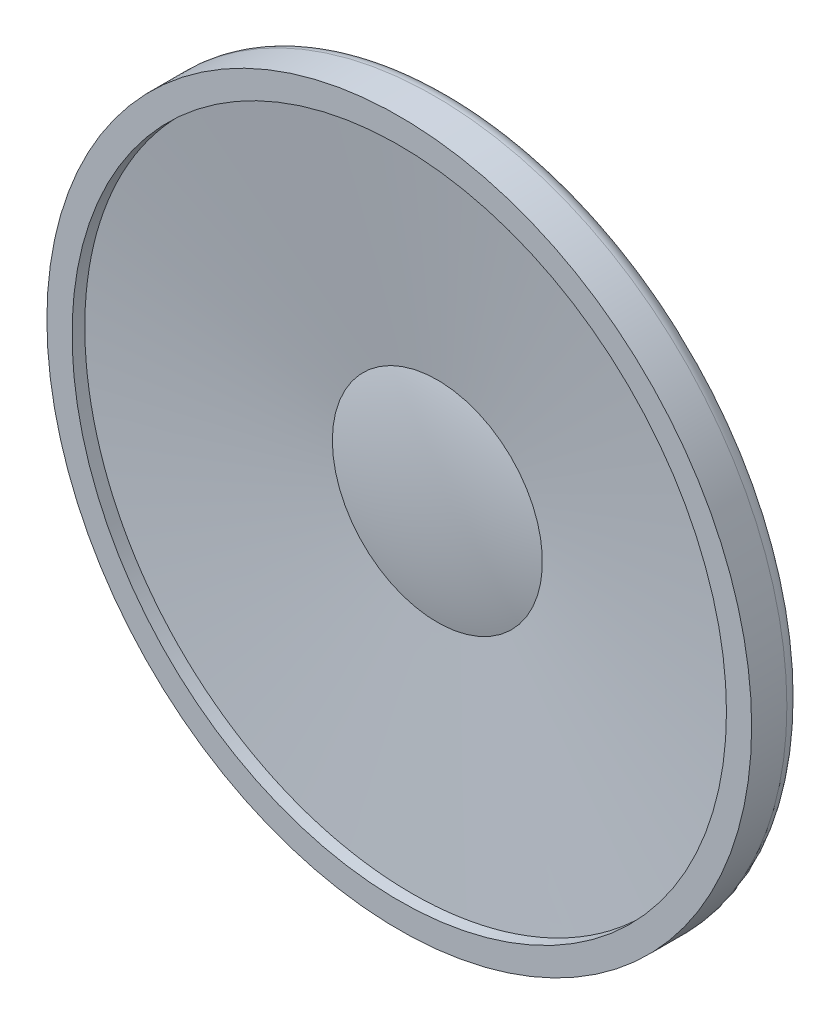
ISO-10303-21;
HEADER;
FILE_DESCRIPTION(('STEP AP214'),'2;1');
FILE_NAME('part.step','',(''),(''),'','','');
FILE_SCHEMA(('AUTOMOTIVE_DESIGN { 1 0 10303 214 1 1 1 1 }'));
ENDSEC;
DATA;
#1=APPLICATION_CONTEXT('core data for automotive mechanical design processes');
#2=APPLICATION_PROTOCOL_DEFINITION('international standard','automotive_design',2000,#1);
#3=PRODUCT_CONTEXT('',#1,'mechanical');
#4=PRODUCT('Part','Part','',(#3));
#5=PRODUCT_RELATED_PRODUCT_CATEGORY('part','',(#4));
#6=PRODUCT_DEFINITION_FORMATION('','',#4);
#7=PRODUCT_DEFINITION_CONTEXT('part definition',#1,'design');
#8=PRODUCT_DEFINITION('design','',#6,#7);
#9=PRODUCT_DEFINITION_SHAPE('','',#8);
#10=(LENGTH_UNIT() NAMED_UNIT(*) SI_UNIT(.MILLI.,.METRE.));
#11=(NAMED_UNIT(*) PLANE_ANGLE_UNIT() SI_UNIT($,.RADIAN.));
#12=(NAMED_UNIT(*) SI_UNIT($,.STERADIAN.) SOLID_ANGLE_UNIT());
#13=UNCERTAINTY_MEASURE_WITH_UNIT(LENGTH_MEASURE(1.E-05),#10,'distance_accuracy_value','');
#14=(GEOMETRIC_REPRESENTATION_CONTEXT(3) GLOBAL_UNCERTAINTY_ASSIGNED_CONTEXT((#13)) GLOBAL_UNIT_ASSIGNED_CONTEXT((#10,
#11,#12)) REPRESENTATION_CONTEXT('',''));
#15=CARTESIAN_POINT('',(0.,0.,0.));
#16=DIRECTION('',(0.,0.,1.));
#17=DIRECTION('',(1.,0.,0.));
#18=AXIS2_PLACEMENT_3D('',#15,#16,#17);
#19=CARTESIAN_POINT('',(0.,0.,-2.));
#20=CARTESIAN_POINT('',(-6.57581322514623,0.,-1.90704795126734));
#21=CARTESIAN_POINT('',(-13.,0.,-0.5));
#22=(BOUNDED_CURVE() B_SPLINE_CURVE(2,(#19,#20,#21),.UNSPECIFIED.,.F.,
.F.) B_SPLINE_CURVE_WITH_KNOTS((3,3),(0.,1.),
.UNSPECIFIED.) CURVE() GEOMETRIC_REPRESENTATION_ITEM() RATIONAL_B_SPLINE_CURVE((1.,
0.658700930773034,1.)) REPRESENTATION_ITEM(''));
#23=CARTESIAN_POINT('',(0.,0.,-2.));
#24=DIRECTION('',(0.,0.,-1.));
#25=AXIS1_PLACEMENT('',#23,#24);
#26=SURFACE_OF_REVOLUTION('',#22,#25);
#27=CARTESIAN_POINT('',(0.,0.,-0.5));
#28=DIRECTION('',(0.,0.,-1.));
#29=DIRECTION('',(-1.,0.,0.));
#30=AXIS2_PLACEMENT_3D('',#27,#28,#29);
#31=CIRCLE('',#30,13.);
#32=CARTESIAN_POINT('',(-13.,0.,-0.5));
#33=VERTEX_POINT('',#32);
#34=EDGE_CURVE('E51',#33,#33,#31,.T.);
#35=ORIENTED_EDGE('',*,*,#34,.T.);
#36=EDGE_LOOP('',(#35));
#37=FACE_BOUND('',#36,.T.);
#38=CARTESIAN_POINT('',(0.,0.,-2.));
#39=VERTEX_POINT('',#38);
#40=VERTEX_LOOP('',#39);
#41=FACE_BOUND('',#40,.T.);
#42=ADVANCED_FACE('F43',(#37,#41),#26,.F.);
#43=CARTESIAN_POINT('',(-4.17258172321156,0.,-1.51391132806224));
#44=CARTESIAN_POINT('',(-2.32060044079949,0.,-1.06389143003336));
#45=CARTESIAN_POINT('',(0.,0.,-1.06389143003336));
#46=(BOUNDED_CURVE() B_SPLINE_CURVE(2,(#43,#44,#45),.UNSPECIFIED.,.F.,
.F.) B_SPLINE_CURVE_WITH_KNOTS((3,3),(0.,1.),
.UNSPECIFIED.) CURVE() GEOMETRIC_REPRESENTATION_ITEM() RATIONAL_B_SPLINE_CURVE((1.,
0.948172254224293,1.)) REPRESENTATION_ITEM(''));
#47=CARTESIAN_POINT('',(0.,0.,-2.));
#48=DIRECTION('',(0.,0.,-1.));
#49=AXIS1_PLACEMENT('',#47,#48);
#50=SURFACE_OF_REVOLUTION('',#46,#49);
#51=CARTESIAN_POINT('',(0.,0.,-1.06389143003336));
#52=VERTEX_POINT('',#51);
#53=VERTEX_LOOP('',#52);
#54=FACE_BOUND('',#53,.T.);
#55=CARTESIAN_POINT('',(0.,0.,-1.51391132806224));
#56=DIRECTION('',(0.,0.,-1.));
#57=DIRECTION('',(-1.,0.,0.));
#58=AXIS2_PLACEMENT_3D('',#55,#56,#57);
#59=CIRCLE('',#58,4.17258172321156);
#60=CARTESIAN_POINT('',(-4.17258172321156,0.,-1.51391132806224));
#61=VERTEX_POINT('',#60);
#62=EDGE_CURVE('E12',#61,#61,#59,.T.);
#63=ORIENTED_EDGE('',*,*,#62,.F.);
#64=EDGE_LOOP('',(#63));
#65=FACE_BOUND('',#64,.T.);
#66=ADVANCED_FACE('F57',(#54,#65),#50,.F.);
#67=CARTESIAN_POINT('',(-13.,0.,-0.5));
#68=CARTESIAN_POINT('',(-6.34788376906216,0.,-1.26755187280304));
#69=CARTESIAN_POINT('',(-4.17258172321156,0.,-1.51391132806224));
#70=(BOUNDED_CURVE() B_SPLINE_CURVE(2,(#67,#68,#69),.UNSPECIFIED.,.F.,
.F.) B_SPLINE_CURVE_WITH_KNOTS((3,3),(0.,1.),
.UNSPECIFIED.) CURVE() GEOMETRIC_REPRESENTATION_ITEM() RATIONAL_B_SPLINE_CURVE((1.,
1.16302303171904,1.)) REPRESENTATION_ITEM(''));
#71=CARTESIAN_POINT('',(0.,0.,-2.));
#72=DIRECTION('',(0.,0.,-1.));
#73=AXIS1_PLACEMENT('',#71,#72);
#74=SURFACE_OF_REVOLUTION('',#70,#73);
#75=ORIENTED_EDGE('',*,*,#62,.T.);
#76=EDGE_LOOP('',(#75));
#77=FACE_BOUND('',#76,.T.);
#78=ORIENTED_EDGE('',*,*,#34,.F.);
#79=EDGE_LOOP('',(#78));
#80=FACE_BOUND('',#79,.T.);
#81=ADVANCED_FACE('F60',(#77,#80),#74,.F.);
#82=CLOSED_SHELL('',(#42,#66,#81));
#83=MANIFOLD_SOLID_BREP('B2',#82);
#84=CARTESIAN_POINT('',(0.,0.,-2.));
#85=DIRECTION('',(0.,0.,1.));
#86=DIRECTION('',(1.,0.,0.));
#87=AXIS2_PLACEMENT_3D('',#84,#85,#86);
#88=CYLINDRICAL_SURFACE('',#87,14.);
#89=CARTESIAN_POINT('',(0.,0.,-1.4));
#90=DIRECTION('',(0.,0.,1.));
#91=DIRECTION('',(1.,0.,0.));
#92=AXIS2_PLACEMENT_3D('',#89,#90,#91);
#93=CIRCLE('',#92,14.);
#94=CARTESIAN_POINT('',(14.,0.,-1.4));
#95=VERTEX_POINT('',#94);
#96=EDGE_CURVE('E213',#95,#95,#93,.T.);
#97=ORIENTED_EDGE('',*,*,#96,.T.);
#98=EDGE_LOOP('',(#97));
#99=FACE_BOUND('',#98,.T.);
#100=CARTESIAN_POINT('',(0.,0.,0.));
#101=DIRECTION('',(0.,0.,1.));
#102=DIRECTION('',(1.,0.,0.));
#103=AXIS2_PLACEMENT_3D('',#100,#101,#102);
#104=CIRCLE('',#103,14.);
#105=CARTESIAN_POINT('',(14.,0.,0.));
#106=VERTEX_POINT('',#105);
#107=EDGE_CURVE('E205',#106,#106,#104,.T.);
#108=ORIENTED_EDGE('',*,*,#107,.F.);
#109=EDGE_LOOP('',(#108));
#110=FACE_BOUND('',#109,.T.);
#111=ADVANCED_FACE('F111',(#99,#110),#88,.T.);
#112=CARTESIAN_POINT('',(0.,0.,-2.));
#113=DIRECTION('',(0.,0.,1.));
#114=DIRECTION('',(1.,0.,0.));
#115=AXIS2_PLACEMENT_3D('',#112,#113,#114);
#116=PLANE('',#115);
#117=CARTESIAN_POINT('',(0.,0.,-2.));
#118=DIRECTION('',(0.,0.,1.));
#119=DIRECTION('',(1.,0.,0.));
#120=AXIS2_PLACEMENT_3D('',#117,#118,#119);
#121=CIRCLE('',#120,13.4);
#122=CARTESIAN_POINT('',(13.4,0.,-2.));
#123=VERTEX_POINT('',#122);
#124=EDGE_CURVE('E216',#123,#123,#121,.F.);
#125=ORIENTED_EDGE('',*,*,#124,.T.);
#126=EDGE_LOOP('',(#125));
#127=FACE_BOUND('',#126,.T.);
#128=CARTESIAN_POINT('',(0.,0.,-2.));
#129=DIRECTION('',(0.,0.,1.));
#130=DIRECTION('',(1.,0.,0.));
#131=AXIS2_PLACEMENT_3D('',#128,#129,#130);
#132=CIRCLE('',#131,12.5);
#133=CARTESIAN_POINT('',(12.5,0.,-2.));
#134=VERTEX_POINT('',#133);
#135=EDGE_CURVE('E210',#134,#134,#132,.F.);
#136=ORIENTED_EDGE('',*,*,#135,.F.);
#137=EDGE_LOOP('',(#136));
#138=FACE_BOUND('',#137,.T.);
#139=ADVANCED_FACE('F250',(#127,#138),#116,.F.);
#140=CARTESIAN_POINT('',(0.,0.,0.));
#141=DIRECTION('',(0.,0.,1.));
#142=DIRECTION('',(1.,0.,0.));
#143=AXIS2_PLACEMENT_3D('',#140,#141,#142);
#144=PLANE('',#143);
#145=CARTESIAN_POINT('',(0.,0.,0.));
#146=DIRECTION('',(0.,0.,1.));
#147=DIRECTION('',(1.,0.,0.));
#148=AXIS2_PLACEMENT_3D('',#145,#146,#147);
#149=CIRCLE('',#148,13.);
#150=CARTESIAN_POINT('',(13.,0.,0.));
#151=VERTEX_POINT('',#150);
#152=EDGE_CURVE('E195',#151,#151,#149,.T.);
#153=ORIENTED_EDGE('',*,*,#152,.F.);
#154=EDGE_LOOP('',(#153));
#155=FACE_BOUND('',#154,.T.);
#156=ORIENTED_EDGE('',*,*,#107,.T.);
#157=EDGE_LOOP('',(#156));
#158=FACE_BOUND('',#157,.T.);
#159=ADVANCED_FACE('F244',(#155,#158),#144,.T.);
#160=CARTESIAN_POINT('',(0.,0.,-3.));
#161=DIRECTION('',(0.,0.,1.));
#162=DIRECTION('',(1.,0.,0.));
#163=AXIS2_PLACEMENT_3D('',#160,#161,#162);
#164=CYLINDRICAL_SURFACE('',#163,12.5);
#165=CARTESIAN_POINT('',(0.,0.,-2.4));
#166=DIRECTION('',(0.,0.,-1.));
#167=DIRECTION('',(-1.,0.,0.));
#168=AXIS2_PLACEMENT_3D('',#165,#166,#167);
#169=CIRCLE('',#168,12.5);
#170=CARTESIAN_POINT('',(-12.5,0.,-2.4));
#171=VERTEX_POINT('',#170);
#172=EDGE_CURVE('E124',#171,#171,#169,.F.);
#173=ORIENTED_EDGE('',*,*,#172,.T.);
#174=EDGE_LOOP('',(#173));
#175=FACE_BOUND('',#174,.T.);
#176=ORIENTED_EDGE('',*,*,#135,.T.);
#177=EDGE_LOOP('',(#176));
#178=FACE_BOUND('',#177,.T.);
#179=ADVANCED_FACE('F224',(#175,#178),#164,.T.);
#180=CARTESIAN_POINT('',(0.,0.,-3.));
#181=DIRECTION('',(0.,0.,-1.));
#182=DIRECTION('',(-1.,0.,0.));
#183=AXIS2_PLACEMENT_3D('',#180,#181,#182);
#184=PLANE('',#183);
#185=CARTESIAN_POINT('',(6.24010589927625,6.84507009575634,-3.));
#186=DIRECTION('',(0.,0.,-1.));
#187=DIRECTION('',(-0.739008917220658,0.673695643646558,0.));
#188=AXIS2_PLACEMENT_3D('',#185,#186,#187);
#189=CIRCLE('',#188,1.);
#190=CARTESIAN_POINT('',(5.50109698205559,7.5187657394029,-3.));
#191=VERTEX_POINT('',#190);
#192=EDGE_CURVE('E141',#191,#191,#189,.T.);
#193=ORIENTED_EDGE('',*,*,#192,.F.);
#194=EDGE_LOOP('',(#193));
#195=FACE_BOUND('',#194,.T.);
#196=CARTESIAN_POINT('',(8.29144998617627,4.12865152038016,-3.));
#197=DIRECTION('',(0.,0.,-1.));
#198=DIRECTION('',(-0.445738355776536,0.895163291355063,0.));
#199=AXIS2_PLACEMENT_3D('',#196,#197,#198);
#200=CIRCLE('',#199,1.);
#201=CARTESIAN_POINT('',(7.84571163039974,5.02381481173523,-3.));
#202=VERTEX_POINT('',#201);
#203=EDGE_CURVE('E365',#202,#202,#200,.T.);
#204=ORIENTED_EDGE('',*,*,#203,.F.);
#205=EDGE_LOOP('',(#204));
#206=FACE_BOUND('',#205,.T.);
#207=CARTESIAN_POINT('',(9.22298780793276,0.854635679528805,-3.));
#208=DIRECTION('',(0.,0.,-1.));
#209=DIRECTION('',(-0.0922683594632987,0.995734176295035,0.));
#210=AXIS2_PLACEMENT_3D('',#207,#208,#209);
#211=CIRCLE('',#210,1.);
#212=CARTESIAN_POINT('',(9.13071944846946,1.85036985582384,-3.));
#213=VERTEX_POINT('',#212);
#214=EDGE_CURVE('E368',#213,#213,#211,.T.);
#215=ORIENTED_EDGE('',*,*,#214,.F.);
#216=EDGE_LOOP('',(#215));
#217=FACE_BOUND('',#216,.T.);
#218=CARTESIAN_POINT('',(8.90891001988823,-2.5348034455427,-3.));
#219=DIRECTION('',(0.,0.,-1.));
#220=DIRECTION('',(0.273662990072087,0.961825643172818,0.));
#221=AXIS2_PLACEMENT_3D('',#218,#219,#220);
#222=CIRCLE('',#221,1.);
#223=CARTESIAN_POINT('',(9.18257300996031,-1.57297780236988,-3.));
#224=VERTEX_POINT('',#223);
#225=EDGE_CURVE('E373',#224,#224,#222,.T.);
#226=ORIENTED_EDGE('',*,*,#225,.F.);
#227=EDGE_LOOP('',(#226));
#228=FACE_BOUND('',#227,.T.);
#229=CARTESIAN_POINT('',(7.39163456768319,-5.5819033194629,-3.));
#230=DIRECTION('',(0.,0.,-1.));
#231=DIRECTION('',(0.602634636379261,0.798017227280236,0.));
#232=AXIS2_PLACEMENT_3D('',#229,#230,#231);
#233=CIRCLE('',#232,1.);
#234=CARTESIAN_POINT('',(7.99426920406245,-4.78388609218266,-3.));
#235=VERTEX_POINT('',#234);
#236=EDGE_CURVE('E376',#235,#235,#233,.T.);
#237=ORIENTED_EDGE('',*,*,#236,.F.);
#238=EDGE_LOOP('',(#237));
#239=FACE_BOUND('',#238,.T.);
#240=CARTESIAN_POINT('',(4.87607790865146,-7.87513621969558,-3.));
#241=DIRECTION('',(0.,0.,-1.));
#242=DIRECTION('',(0.850217135729617,0.526432162877351,0.));
#243=AXIS2_PLACEMENT_3D('',#240,#241,#242);
#244=CIRCLE('',#243,1.);
#245=CARTESIAN_POINT('',(5.72629504438108,-7.34870405681823,-3.));
#246=VERTEX_POINT('',#245);
#247=EDGE_CURVE('E379',#246,#246,#244,.T.);
#248=ORIENTED_EDGE('',*,*,#247,.F.);
#249=EDGE_LOOP('',(#248));
#250=FACE_BOUND('',#249,.T.);
#251=CARTESIAN_POINT('',(1.70197990877592,-9.10478833582215,-3.));
#252=DIRECTION('',(0.,0.,-1.));
#253=DIRECTION('',(0.982973099683903,0.183749517816564,0.));
#254=AXIS2_PLACEMENT_3D('',#251,#252,#253);
#255=CIRCLE('',#254,1.);
#256=CARTESIAN_POINT('',(2.68495300845983,-8.92103881800559,-3.));
#257=VERTEX_POINT('',#256);
#258=EDGE_CURVE('E382',#257,#257,#255,.T.);
#259=ORIENTED_EDGE('',*,*,#258,.F.);
#260=EDGE_LOOP('',(#259));
#261=FACE_BOUND('',#260,.T.);
#262=CARTESIAN_POINT('',(-1.70197990877605,-9.10478833582213,-3.));
#263=DIRECTION('',(0.,0.,-1.));
#264=DIRECTION('',(0.9829730996839,-0.183749517816578,0.));
#265=AXIS2_PLACEMENT_3D('',#262,#263,#264);
#266=CIRCLE('',#265,1.);
#267=CARTESIAN_POINT('',(-0.719006809092148,-9.28853785363871,-3.));
#268=VERTEX_POINT('',#267);
#269=EDGE_CURVE('E385',#268,#268,#266,.T.);
#270=ORIENTED_EDGE('',*,*,#269,.F.);
#271=EDGE_LOOP('',(#270));
#272=FACE_BOUND('',#271,.T.);
#273=CARTESIAN_POINT('',(-4.87607790865157,-7.87513621969551,-3.));
#274=DIRECTION('',(0.,0.,-1.));
#275=DIRECTION('',(0.85021713572961,-0.526432162877363,0.));
#276=AXIS2_PLACEMENT_3D('',#273,#274,#275);
#277=CIRCLE('',#276,1.);
#278=CARTESIAN_POINT('',(-4.02586077292196,-8.40156838257288,-3.));
#279=VERTEX_POINT('',#278);
#280=EDGE_CURVE('E388',#279,#279,#277,.T.);
#281=ORIENTED_EDGE('',*,*,#280,.F.);
#282=EDGE_LOOP('',(#281));
#283=FACE_BOUND('',#282,.T.);
#284=CARTESIAN_POINT('',(-7.39163456768327,-5.5819033194628,-3.));
#285=DIRECTION('',(0.,0.,-1.));
#286=DIRECTION('',(0.602634636379249,-0.798017227280245,0.));
#287=AXIS2_PLACEMENT_3D('',#284,#285,#286);
#288=CIRCLE('',#287,1.);
#289=CARTESIAN_POINT('',(-6.78899993130402,-6.37992054674304,-3.));
#290=VERTEX_POINT('',#289);
#291=EDGE_CURVE('E391',#290,#290,#288,.T.);
#292=ORIENTED_EDGE('',*,*,#291,.F.);
#293=EDGE_LOOP('',(#292));
#294=FACE_BOUND('',#293,.T.);
#295=CARTESIAN_POINT('',(-8.90891001988826,-2.53480344554258,-3.));
#296=DIRECTION('',(0.,0.,-1.));
#297=DIRECTION('',(0.273662990072073,-0.961825643172822,0.));
#298=AXIS2_PLACEMENT_3D('',#295,#296,#297);
#299=CIRCLE('',#298,1.);
#300=CARTESIAN_POINT('',(-8.63524702981619,-3.4966290887154,-3.));
#301=VERTEX_POINT('',#300);
#302=EDGE_CURVE('E394',#301,#301,#299,.T.);
#303=ORIENTED_EDGE('',*,*,#302,.F.);
#304=EDGE_LOOP('',(#303));
#305=FACE_BOUND('',#304,.T.);
#306=CARTESIAN_POINT('',(-9.22298780793275,0.854635679528937,-3.));
#307=DIRECTION('',(0.,0.,-1.));
#308=DIRECTION('',(-0.092268359463313,-0.995734176295033,0.));
#309=AXIS2_PLACEMENT_3D('',#306,#307,#308);
#310=CIRCLE('',#309,1.);
#311=CARTESIAN_POINT('',(-9.31525616739606,-0.141098496766097,-3.));
#312=VERTEX_POINT('',#311);
#313=EDGE_CURVE('E397',#312,#312,#310,.T.);
#314=ORIENTED_EDGE('',*,*,#313,.F.);
#315=EDGE_LOOP('',(#314));
#316=FACE_BOUND('',#315,.T.);
#317=CARTESIAN_POINT('',(-8.29144998617621,4.12865152038028,-3.));
#318=DIRECTION('',(0.,0.,-1.));
#319=DIRECTION('',(-0.445738355776549,-0.895163291355057,0.));
#320=AXIS2_PLACEMENT_3D('',#317,#318,#319);
#321=CIRCLE('',#320,1.);
#322=CARTESIAN_POINT('',(-8.73718834195276,3.23348822902523,-3.));
#323=VERTEX_POINT('',#322);
#324=EDGE_CURVE('E400',#323,#323,#321,.T.);
#325=ORIENTED_EDGE('',*,*,#324,.F.);
#326=EDGE_LOOP('',(#325));
#327=FACE_BOUND('',#326,.T.);
#328=CARTESIAN_POINT('',(-6.24010589927615,6.84507009575643,-3.));
#329=DIRECTION('',(0.,0.,-1.));
#330=DIRECTION('',(-0.739008917220668,-0.673695643646548,0.));
#331=AXIS2_PLACEMENT_3D('',#328,#329,#330);
#332=CIRCLE('',#331,1.);
#333=CARTESIAN_POINT('',(-6.97911481649682,6.17137445210988,-3.));
#334=VERTEX_POINT('',#333);
#335=EDGE_CURVE('E402',#334,#334,#332,.T.);
#336=ORIENTED_EDGE('',*,*,#335,.F.);
#337=EDGE_LOOP('',(#336));
#338=FACE_BOUND('',#337,.T.);
#339=CARTESIAN_POINT('',(-3.34600093305839,8.63702402485789,-3.));
#340=DIRECTION('',(0.,0.,-1.));
#341=DIRECTION('',(-0.932472229404361,-0.361241666187141,0.));
#342=AXIS2_PLACEMENT_3D('',#339,#340,#341);
#343=CIRCLE('',#342,1.);
#344=CARTESIAN_POINT('',(-4.27847316246275,8.27578235867075,-3.));
#345=VERTEX_POINT('',#344);
#346=EDGE_CURVE('E189',#345,#345,#343,.T.);
#347=ORIENTED_EDGE('',*,*,#346,.F.);
#348=EDGE_LOOP('',(#347));
#349=FACE_BOUND('',#348,.T.);
#350=CARTESIAN_POINT('',(3.34600093305851,8.63702402485784,-3.));
#351=DIRECTION('',(0.,0.,-1.));
#352=DIRECTION('',(-0.932472229404355,0.361241666187154,0.));
#353=AXIS2_PLACEMENT_3D('',#350,#351,#352);
#354=CIRCLE('',#353,1.);
#355=CARTESIAN_POINT('',(2.41352870365415,8.998265691045,-3.));
#356=VERTEX_POINT('',#355);
#357=EDGE_CURVE('E136',#356,#356,#354,.T.);
#358=ORIENTED_EDGE('',*,*,#357,.F.);
#359=EDGE_LOOP('',(#358));
#360=FACE_BOUND('',#359,.T.);
#361=CARTESIAN_POINT('',(0.,9.2625,-3.));
#362=DIRECTION('',(0.,0.,-1.));
#363=DIRECTION('',(-1.,0.,0.));
#364=AXIS2_PLACEMENT_3D('',#361,#362,#363);
#365=CIRCLE('',#364,1.);
#366=CARTESIAN_POINT('',(-1.,9.2625,-3.));
#367=VERTEX_POINT('',#366);
#368=EDGE_CURVE('E132',#367,#367,#365,.T.);
#369=ORIENTED_EDGE('',*,*,#368,.F.);
#370=EDGE_LOOP('',(#369));
#371=FACE_BOUND('',#370,.T.);
#372=CARTESIAN_POINT('',(0.,0.,-3.));
#373=DIRECTION('',(0.,0.,-1.));
#374=DIRECTION('',(-1.,0.,0.));
#375=AXIS2_PLACEMENT_3D('',#372,#373,#374);
#376=CIRCLE('',#375,6.625);
#377=CARTESIAN_POINT('',(-6.625,0.,-3.));
#378=VERTEX_POINT('',#377);
#379=EDGE_CURVE('E131',#378,#378,#376,.T.);
#380=ORIENTED_EDGE('',*,*,#379,.F.);
#381=EDGE_LOOP('',(#380));
#382=FACE_BOUND('',#381,.T.);
#383=CARTESIAN_POINT('',(0.,0.,-3.));
#384=DIRECTION('',(0.,0.,-1.));
#385=DIRECTION('',(-1.,0.,0.));
#386=AXIS2_PLACEMENT_3D('',#383,#384,#385);
#387=CIRCLE('',#386,11.9);
#388=CARTESIAN_POINT('',(-11.9,0.,-3.));
#389=VERTEX_POINT('',#388);
#390=EDGE_CURVE('E219',#389,#389,#387,.T.);
#391=ORIENTED_EDGE('',*,*,#390,.T.);
#392=EDGE_LOOP('',(#391));
#393=FACE_BOUND('',#392,.T.);
#394=ADVANCED_FACE('F234',(#195,#206,#217,#228,#239,#250,#261,#272,#283,#294,#305,#316,#327,
#338,#349,#360,#371,#382,#393),#184,.T.);
#395=CARTESIAN_POINT('',(0.,0.,-1.4));
#396=DIRECTION('',(0.,0.,1.));
#397=DIRECTION('',(1.,0.,0.));
#398=AXIS2_PLACEMENT_3D('',#395,#396,#397);
#399=TOROIDAL_SURFACE('',#398,13.4,0.6);
#400=ORIENTED_EDGE('',*,*,#124,.F.);
#401=EDGE_LOOP('',(#400));
#402=FACE_BOUND('',#401,.T.);
#403=ORIENTED_EDGE('',*,*,#96,.F.);
#404=EDGE_LOOP('',(#403));
#405=FACE_BOUND('',#404,.T.);
#406=ADVANCED_FACE('F231',(#402,#405),#399,.T.);
#407=CARTESIAN_POINT('',(0.,0.,-2.4));
#408=DIRECTION('',(0.,0.,-1.));
#409=DIRECTION('',(-1.,0.,0.));
#410=AXIS2_PLACEMENT_3D('',#407,#408,#409);
#411=TOROIDAL_SURFACE('',#410,11.9,0.6);
#412=ORIENTED_EDGE('',*,*,#172,.F.);
#413=EDGE_LOOP('',(#412));
#414=FACE_BOUND('',#413,.T.);
#415=ORIENTED_EDGE('',*,*,#390,.F.);
#416=EDGE_LOOP('',(#415));
#417=FACE_BOUND('',#416,.T.);
#418=ADVANCED_FACE('F227',(#414,#417),#411,.T.);
#419=CARTESIAN_POINT('',(0.,0.,-2.));
#420=DIRECTION('',(0.,0.,1.));
#421=DIRECTION('',(1.,0.,0.));
#422=AXIS2_PLACEMENT_3D('',#419,#420,#421);
#423=CYLINDRICAL_SURFACE('',#422,13.);
#424=ORIENTED_EDGE('',*,*,#152,.T.);
#425=EDGE_LOOP('',(#424));
#426=FACE_BOUND('',#425,.T.);
#427=CARTESIAN_POINT('',(0.,0.,-1.));
#428=DIRECTION('',(0.,0.,1.));
#429=DIRECTION('',(1.,0.,0.));
#430=AXIS2_PLACEMENT_3D('',#427,#428,#429);
#431=CIRCLE('',#430,13.);
#432=CARTESIAN_POINT('',(13.,0.,-1.));
#433=VERTEX_POINT('',#432);
#434=EDGE_CURVE('E196',#433,#433,#431,.T.);
#435=ORIENTED_EDGE('',*,*,#434,.F.);
#436=EDGE_LOOP('',(#435));
#437=FACE_BOUND('',#436,.T.);
#438=ADVANCED_FACE('F230',(#426,#437),#423,.F.);
#439=CARTESIAN_POINT('',(0.,0.,-1.));
#440=DIRECTION('',(0.,0.,1.));
#441=DIRECTION('',(1.,0.,0.));
#442=AXIS2_PLACEMENT_3D('',#439,#440,#441);
#443=PLANE('',#442);
#444=ORIENTED_EDGE('',*,*,#434,.T.);
#445=EDGE_LOOP('',(#444));
#446=FACE_BOUND('',#445,.T.);
#447=CARTESIAN_POINT('',(0.,0.,-1.));
#448=DIRECTION('',(0.,0.,1.));
#449=DIRECTION('',(1.,0.,0.));
#450=AXIS2_PLACEMENT_3D('',#447,#448,#449);
#451=CIRCLE('',#450,11.5);
#452=CARTESIAN_POINT('',(11.5,0.,-1.));
#453=VERTEX_POINT('',#452);
#454=EDGE_CURVE('E200',#453,#453,#451,.F.);
#455=ORIENTED_EDGE('',*,*,#454,.T.);
#456=EDGE_LOOP('',(#455));
#457=FACE_BOUND('',#456,.T.);
#458=ADVANCED_FACE('F270',(#446,#457),#443,.T.);
#459=CARTESIAN_POINT('',(0.,0.,-3.));
#460=DIRECTION('',(0.,0.,1.));
#461=DIRECTION('',(1.,0.,0.));
#462=AXIS2_PLACEMENT_3D('',#459,#460,#461);
#463=CYLINDRICAL_SURFACE('',#462,11.5);
#464=CARTESIAN_POINT('',(0.,0.,-2.5));
#465=DIRECTION('',(0.,0.,-1.));
#466=DIRECTION('',(-1.,0.,0.));
#467=AXIS2_PLACEMENT_3D('',#464,#465,#466);
#468=CIRCLE('',#467,11.5);
#469=CARTESIAN_POINT('',(-11.5,0.,-2.5));
#470=VERTEX_POINT('',#469);
#471=EDGE_CURVE('E199',#470,#470,#468,.T.);
#472=ORIENTED_EDGE('',*,*,#471,.T.);
#473=EDGE_LOOP('',(#472));
#474=FACE_BOUND('',#473,.T.);
#475=ORIENTED_EDGE('',*,*,#454,.F.);
#476=EDGE_LOOP('',(#475));
#477=FACE_BOUND('',#476,.T.);
#478=ADVANCED_FACE('F276',(#474,#477),#463,.F.);
#479=CARTESIAN_POINT('',(0.,0.,-2.5));
#480=DIRECTION('',(0.,0.,-1.));
#481=DIRECTION('',(-1.,0.,0.));
#482=AXIS2_PLACEMENT_3D('',#479,#480,#481);
#483=PLANE('',#482);
#484=CARTESIAN_POINT('',(6.24010589927625,6.84507009575634,-2.5));
#485=DIRECTION('',(0.,0.,-1.));
#486=DIRECTION('',(-1.,0.,0.));
#487=AXIS2_PLACEMENT_3D('',#484,#485,#486);
#488=CIRCLE('',#487,1.);
#489=CARTESIAN_POINT('',(5.24010589927625,6.84507009575634,-2.5));
#490=VERTEX_POINT('',#489);
#491=EDGE_CURVE('E115',#490,#490,#488,.T.);
#492=ORIENTED_EDGE('',*,*,#491,.T.);
#493=EDGE_LOOP('',(#492));
#494=FACE_BOUND('',#493,.T.);
#495=CARTESIAN_POINT('',(8.29144998617627,4.12865152038016,-2.5));
#496=DIRECTION('',(0.,0.,-1.));
#497=DIRECTION('',(-1.,0.,0.));
#498=AXIS2_PLACEMENT_3D('',#495,#496,#497);
#499=CIRCLE('',#498,1.);
#500=CARTESIAN_POINT('',(7.29144998617627,4.12865152038016,-2.5));
#501=VERTEX_POINT('',#500);
#502=EDGE_CURVE('E176',#501,#501,#499,.T.);
#503=ORIENTED_EDGE('',*,*,#502,.T.);
#504=EDGE_LOOP('',(#503));
#505=FACE_BOUND('',#504,.T.);
#506=CARTESIAN_POINT('',(9.22298780793276,0.854635679528805,-2.5));
#507=DIRECTION('',(0.,0.,-1.));
#508=DIRECTION('',(-1.,0.,0.));
#509=AXIS2_PLACEMENT_3D('',#506,#507,#508);
#510=CIRCLE('',#509,1.);
#511=CARTESIAN_POINT('',(8.22298780793276,0.854635679528805,-2.5));
#512=VERTEX_POINT('',#511);
#513=EDGE_CURVE('E174',#512,#512,#510,.T.);
#514=ORIENTED_EDGE('',*,*,#513,.T.);
#515=EDGE_LOOP('',(#514));
#516=FACE_BOUND('',#515,.T.);
#517=CARTESIAN_POINT('',(8.90891001988823,-2.5348034455427,-2.5));
#518=DIRECTION('',(0.,0.,-1.));
#519=DIRECTION('',(-1.,0.,0.));
#520=AXIS2_PLACEMENT_3D('',#517,#518,#519);
#521=CIRCLE('',#520,1.);
#522=CARTESIAN_POINT('',(7.90891001988823,-2.5348034455427,-2.5));
#523=VERTEX_POINT('',#522);
#524=EDGE_CURVE('E171',#523,#523,#521,.T.);
#525=ORIENTED_EDGE('',*,*,#524,.T.);
#526=EDGE_LOOP('',(#525));
#527=FACE_BOUND('',#526,.T.);
#528=CARTESIAN_POINT('',(7.39163456768319,-5.5819033194629,-2.5));
#529=DIRECTION('',(0.,0.,-1.));
#530=DIRECTION('',(-1.,0.,0.));
#531=AXIS2_PLACEMENT_3D('',#528,#529,#530);
#532=CIRCLE('',#531,1.);
#533=CARTESIAN_POINT('',(6.39163456768319,-5.5819033194629,-2.5));
#534=VERTEX_POINT('',#533);
#535=EDGE_CURVE('E168',#534,#534,#532,.T.);
#536=ORIENTED_EDGE('',*,*,#535,.T.);
#537=EDGE_LOOP('',(#536));
#538=FACE_BOUND('',#537,.T.);
#539=CARTESIAN_POINT('',(4.87607790865146,-7.87513621969558,-2.5));
#540=DIRECTION('',(0.,0.,-1.));
#541=DIRECTION('',(-1.,0.,0.));
#542=AXIS2_PLACEMENT_3D('',#539,#540,#541);
#543=CIRCLE('',#542,1.);
#544=CARTESIAN_POINT('',(3.87607790865146,-7.87513621969558,-2.5));
#545=VERTEX_POINT('',#544);
#546=EDGE_CURVE('E165',#545,#545,#543,.T.);
#547=ORIENTED_EDGE('',*,*,#546,.T.);
#548=EDGE_LOOP('',(#547));
#549=FACE_BOUND('',#548,.T.);
#550=CARTESIAN_POINT('',(1.70197990877592,-9.10478833582215,-2.5));
#551=DIRECTION('',(0.,0.,-1.));
#552=DIRECTION('',(-1.,0.,0.));
#553=AXIS2_PLACEMENT_3D('',#550,#551,#552);
#554=CIRCLE('',#553,1.);
#555=CARTESIAN_POINT('',(0.701979908775922,-9.10478833582215,-2.5));
#556=VERTEX_POINT('',#555);
#557=EDGE_CURVE('E162',#556,#556,#554,.T.);
#558=ORIENTED_EDGE('',*,*,#557,.T.);
#559=EDGE_LOOP('',(#558));
#560=FACE_BOUND('',#559,.T.);
#561=CARTESIAN_POINT('',(-1.70197990877605,-9.10478833582213,-2.5));
#562=DIRECTION('',(0.,0.,-1.));
#563=DIRECTION('',(-1.,0.,0.));
#564=AXIS2_PLACEMENT_3D('',#561,#562,#563);
#565=CIRCLE('',#564,1.);
#566=CARTESIAN_POINT('',(-2.70197990877605,-9.10478833582213,-2.5));
#567=VERTEX_POINT('',#566);
#568=EDGE_CURVE('E159',#567,#567,#565,.T.);
#569=ORIENTED_EDGE('',*,*,#568,.T.);
#570=EDGE_LOOP('',(#569));
#571=FACE_BOUND('',#570,.T.);
#572=CARTESIAN_POINT('',(-4.87607790865157,-7.87513621969551,-2.5));
#573=DIRECTION('',(0.,0.,-1.));
#574=DIRECTION('',(-1.,0.,0.));
#575=AXIS2_PLACEMENT_3D('',#572,#573,#574);
#576=CIRCLE('',#575,1.);
#577=CARTESIAN_POINT('',(-5.87607790865157,-7.87513621969551,-2.5));
#578=VERTEX_POINT('',#577);
#579=EDGE_CURVE('E156',#578,#578,#576,.T.);
#580=ORIENTED_EDGE('',*,*,#579,.T.);
#581=EDGE_LOOP('',(#580));
#582=FACE_BOUND('',#581,.T.);
#583=CARTESIAN_POINT('',(-7.39163456768327,-5.5819033194628,-2.5));
#584=DIRECTION('',(0.,0.,-1.));
#585=DIRECTION('',(-1.,0.,0.));
#586=AXIS2_PLACEMENT_3D('',#583,#584,#585);
#587=CIRCLE('',#586,1.);
#588=CARTESIAN_POINT('',(-8.39163456768327,-5.5819033194628,-2.5));
#589=VERTEX_POINT('',#588);
#590=EDGE_CURVE('E153',#589,#589,#587,.T.);
#591=ORIENTED_EDGE('',*,*,#590,.T.);
#592=EDGE_LOOP('',(#591));
#593=FACE_BOUND('',#592,.T.);
#594=CARTESIAN_POINT('',(-8.90891001988826,-2.53480344554258,-2.5));
#595=DIRECTION('',(0.,0.,-1.));
#596=DIRECTION('',(-1.,0.,0.));
#597=AXIS2_PLACEMENT_3D('',#594,#595,#596);
#598=CIRCLE('',#597,1.);
#599=CARTESIAN_POINT('',(-9.90891001988826,-2.53480344554258,-2.5));
#600=VERTEX_POINT('',#599);
#601=EDGE_CURVE('E150',#600,#600,#598,.T.);
#602=ORIENTED_EDGE('',*,*,#601,.T.);
#603=EDGE_LOOP('',(#602));
#604=FACE_BOUND('',#603,.T.);
#605=CARTESIAN_POINT('',(-9.22298780793275,0.854635679528937,-2.5));
#606=DIRECTION('',(0.,0.,-1.));
#607=DIRECTION('',(-1.,0.,0.));
#608=AXIS2_PLACEMENT_3D('',#605,#606,#607);
#609=CIRCLE('',#608,1.);
#610=CARTESIAN_POINT('',(-10.2229878079327,0.854635679528937,-2.5));
#611=VERTEX_POINT('',#610);
#612=EDGE_CURVE('E147',#611,#611,#609,.T.);
#613=ORIENTED_EDGE('',*,*,#612,.T.);
#614=EDGE_LOOP('',(#613));
#615=FACE_BOUND('',#614,.T.);
#616=CARTESIAN_POINT('',(-8.29144998617621,4.12865152038028,-2.5));
#617=DIRECTION('',(0.,0.,-1.));
#618=DIRECTION('',(-1.,0.,0.));
#619=AXIS2_PLACEMENT_3D('',#616,#617,#618);
#620=CIRCLE('',#619,1.);
#621=CARTESIAN_POINT('',(-9.29144998617622,4.12865152038028,-2.5));
#622=VERTEX_POINT('',#621);
#623=EDGE_CURVE('E144',#622,#622,#620,.T.);
#624=ORIENTED_EDGE('',*,*,#623,.T.);
#625=EDGE_LOOP('',(#624));
#626=FACE_BOUND('',#625,.T.);
#627=CARTESIAN_POINT('',(-6.24010589927615,6.84507009575643,-2.5));
#628=DIRECTION('',(0.,0.,-1.));
#629=DIRECTION('',(-1.,0.,0.));
#630=AXIS2_PLACEMENT_3D('',#627,#628,#629);
#631=CIRCLE('',#630,1.);
#632=CARTESIAN_POINT('',(-7.24010589927615,6.84507009575643,-2.5));
#633=VERTEX_POINT('',#632);
#634=EDGE_CURVE('E140',#633,#633,#631,.T.);
#635=ORIENTED_EDGE('',*,*,#634,.T.);
#636=EDGE_LOOP('',(#635));
#637=FACE_BOUND('',#636,.T.);
#638=CARTESIAN_POINT('',(-3.34600093305839,8.63702402485789,-2.5));
#639=DIRECTION('',(0.,0.,-1.));
#640=DIRECTION('',(-1.,0.,0.));
#641=AXIS2_PLACEMENT_3D('',#638,#639,#640);
#642=CIRCLE('',#641,1.);
#643=CARTESIAN_POINT('',(-4.34600093305839,8.63702402485789,-2.5));
#644=VERTEX_POINT('',#643);
#645=EDGE_CURVE('E137',#644,#644,#642,.T.);
#646=ORIENTED_EDGE('',*,*,#645,.T.);
#647=EDGE_LOOP('',(#646));
#648=FACE_BOUND('',#647,.T.);
#649=CARTESIAN_POINT('',(3.34600093305851,8.63702402485784,-2.5));
#650=DIRECTION('',(0.,0.,-1.));
#651=DIRECTION('',(-1.,0.,0.));
#652=AXIS2_PLACEMENT_3D('',#649,#650,#651);
#653=CIRCLE('',#652,1.);
#654=CARTESIAN_POINT('',(2.34600093305851,8.63702402485784,-2.5));
#655=VERTEX_POINT('',#654);
#656=EDGE_CURVE('E133',#655,#655,#653,.T.);
#657=ORIENTED_EDGE('',*,*,#656,.T.);
#658=EDGE_LOOP('',(#657));
#659=FACE_BOUND('',#658,.T.);
#660=CARTESIAN_POINT('',(0.,9.2625,-2.5));
#661=DIRECTION('',(0.,0.,-1.));
#662=DIRECTION('',(-1.,0.,0.));
#663=AXIS2_PLACEMENT_3D('',#660,#661,#662);
#664=CIRCLE('',#663,1.);
#665=CARTESIAN_POINT('',(-1.,9.2625,-2.5));
#666=VERTEX_POINT('',#665);
#667=EDGE_CURVE('E128',#666,#666,#664,.T.);
#668=ORIENTED_EDGE('',*,*,#667,.T.);
#669=EDGE_LOOP('',(#668));
#670=FACE_BOUND('',#669,.T.);
#671=ORIENTED_EDGE('',*,*,#471,.F.);
#672=EDGE_LOOP('',(#671));
#673=FACE_BOUND('',#672,.T.);
#674=ADVANCED_FACE('F281',(#494,#505,#516,#527,#538,#549,#560,#571,#582,#593,#604,#615,#626,
#637,#648,#659,#670,#673),#483,.F.);
#675=CARTESIAN_POINT('',(0.,0.,-5.));
#676=DIRECTION('',(0.,0.,1.));
#677=DIRECTION('',(1.,0.,0.));
#678=AXIS2_PLACEMENT_3D('',#675,#676,#677);
#679=CYLINDRICAL_SURFACE('',#678,6.625);
#680=CARTESIAN_POINT('',(0.,0.,-4.4));
#681=DIRECTION('',(0.,0.,-1.));
#682=DIRECTION('',(-1.,0.,0.));
#683=AXIS2_PLACEMENT_3D('',#680,#681,#682);
#684=CIRCLE('',#683,6.625);
#685=CARTESIAN_POINT('',(-6.625,0.,-4.4));
#686=VERTEX_POINT('',#685);
#687=EDGE_CURVE('E42',#686,#686,#684,.F.);
#688=ORIENTED_EDGE('',*,*,#687,.T.);
#689=EDGE_LOOP('',(#688));
#690=FACE_BOUND('',#689,.T.);
#691=ORIENTED_EDGE('',*,*,#379,.T.);
#692=EDGE_LOOP('',(#691));
#693=FACE_BOUND('',#692,.T.);
#694=ADVANCED_FACE('F287',(#690,#693),#679,.T.);
#695=CARTESIAN_POINT('',(0.,0.,-5.));
#696=DIRECTION('',(0.,0.,-1.));
#697=DIRECTION('',(-1.,0.,0.));
#698=AXIS2_PLACEMENT_3D('',#695,#696,#697);
#699=PLANE('',#698);
#700=CARTESIAN_POINT('',(0.,0.,-5.));
#701=DIRECTION('',(0.,0.,-1.));
#702=DIRECTION('',(-1.,0.,0.));
#703=AXIS2_PLACEMENT_3D('',#700,#701,#702);
#704=CIRCLE('',#703,6.025);
#705=CARTESIAN_POINT('',(-6.025,0.,-5.));
#706=VERTEX_POINT('',#705);
#707=EDGE_CURVE('E119',#706,#706,#704,.T.);
#708=ORIENTED_EDGE('',*,*,#707,.T.);
#709=EDGE_LOOP('',(#708));
#710=FACE_BOUND('',#709,.T.);
#711=ADVANCED_FACE('F291',(#710),#699,.T.);
#712=CARTESIAN_POINT('',(0.,0.,-4.4));
#713=DIRECTION('',(0.,0.,-1.));
#714=DIRECTION('',(-1.,0.,0.));
#715=AXIS2_PLACEMENT_3D('',#712,#713,#714);
#716=TOROIDAL_SURFACE('',#715,6.025,0.6);
#717=ORIENTED_EDGE('',*,*,#687,.F.);
#718=EDGE_LOOP('',(#717));
#719=FACE_BOUND('',#718,.T.);
#720=ORIENTED_EDGE('',*,*,#707,.F.);
#721=EDGE_LOOP('',(#720));
#722=FACE_BOUND('',#721,.T.);
#723=ADVANCED_FACE('F113',(#719,#722),#716,.T.);
#724=CARTESIAN_POINT('',(0.,9.2625,0.));
#725=DIRECTION('',(0.,0.,-1.));
#726=DIRECTION('',(-1.,0.,0.));
#727=AXIS2_PLACEMENT_3D('',#724,#725,#726);
#728=CYLINDRICAL_SURFACE('',#727,1.);
#729=ORIENTED_EDGE('',*,*,#368,.T.);
#730=EDGE_LOOP('',(#729));
#731=FACE_BOUND('',#730,.T.);
#732=ORIENTED_EDGE('',*,*,#667,.F.);
#733=EDGE_LOOP('',(#732));
#734=FACE_BOUND('',#733,.T.);
#735=ADVANCED_FACE('F295',(#731,#734),#728,.F.);
#736=CARTESIAN_POINT('',(3.34600093305851,8.63702402485784,0.));
#737=DIRECTION('',(0.,0.,-1.));
#738=DIRECTION('',(-1.,0.,0.));
#739=AXIS2_PLACEMENT_3D('',#736,#737,#738);
#740=CYLINDRICAL_SURFACE('',#739,1.);
#741=ORIENTED_EDGE('',*,*,#357,.T.);
#742=EDGE_LOOP('',(#741));
#743=FACE_BOUND('',#742,.T.);
#744=ORIENTED_EDGE('',*,*,#656,.F.);
#745=EDGE_LOOP('',(#744));
#746=FACE_BOUND('',#745,.T.);
#747=ADVANCED_FACE('F298',(#743,#746),#740,.F.);
#748=CARTESIAN_POINT('',(-3.34600093305839,8.63702402485789,0.));
#749=DIRECTION('',(0.,0.,-1.));
#750=DIRECTION('',(-1.,0.,0.));
#751=AXIS2_PLACEMENT_3D('',#748,#749,#750);
#752=CYLINDRICAL_SURFACE('',#751,1.);
#753=ORIENTED_EDGE('',*,*,#346,.T.);
#754=EDGE_LOOP('',(#753));
#755=FACE_BOUND('',#754,.T.);
#756=ORIENTED_EDGE('',*,*,#645,.F.);
#757=EDGE_LOOP('',(#756));
#758=FACE_BOUND('',#757,.T.);
#759=ADVANCED_FACE('F302',(#755,#758),#752,.F.);
#760=CARTESIAN_POINT('',(-6.24010589927615,6.84507009575643,0.));
#761=DIRECTION('',(0.,0.,-1.));
#762=DIRECTION('',(-1.,0.,0.));
#763=AXIS2_PLACEMENT_3D('',#760,#761,#762);
#764=CYLINDRICAL_SURFACE('',#763,1.);
#765=ORIENTED_EDGE('',*,*,#335,.T.);
#766=EDGE_LOOP('',(#765));
#767=FACE_BOUND('',#766,.T.);
#768=ORIENTED_EDGE('',*,*,#634,.F.);
#769=EDGE_LOOP('',(#768));
#770=FACE_BOUND('',#769,.T.);
#771=ADVANCED_FACE('F305',(#767,#770),#764,.F.);
#772=CARTESIAN_POINT('',(-8.29144998617621,4.12865152038028,0.));
#773=DIRECTION('',(0.,0.,-1.));
#774=DIRECTION('',(-1.,0.,0.));
#775=AXIS2_PLACEMENT_3D('',#772,#773,#774);
#776=CYLINDRICAL_SURFACE('',#775,1.);
#777=ORIENTED_EDGE('',*,*,#324,.T.);
#778=EDGE_LOOP('',(#777));
#779=FACE_BOUND('',#778,.T.);
#780=ORIENTED_EDGE('',*,*,#623,.F.);
#781=EDGE_LOOP('',(#780));
#782=FACE_BOUND('',#781,.T.);
#783=ADVANCED_FACE('F309',(#779,#782),#776,.F.);
#784=CARTESIAN_POINT('',(-9.22298780793275,0.854635679528937,0.));
#785=DIRECTION('',(0.,0.,-1.));
#786=DIRECTION('',(-1.,0.,0.));
#787=AXIS2_PLACEMENT_3D('',#784,#785,#786);
#788=CYLINDRICAL_SURFACE('',#787,1.);
#789=ORIENTED_EDGE('',*,*,#313,.T.);
#790=EDGE_LOOP('',(#789));
#791=FACE_BOUND('',#790,.T.);
#792=ORIENTED_EDGE('',*,*,#612,.F.);
#793=EDGE_LOOP('',(#792));
#794=FACE_BOUND('',#793,.T.);
#795=ADVANCED_FACE('F313',(#791,#794),#788,.F.);
#796=CARTESIAN_POINT('',(-8.90891001988826,-2.53480344554258,0.));
#797=DIRECTION('',(0.,0.,-1.));
#798=DIRECTION('',(-1.,0.,0.));
#799=AXIS2_PLACEMENT_3D('',#796,#797,#798);
#800=CYLINDRICAL_SURFACE('',#799,1.);
#801=ORIENTED_EDGE('',*,*,#302,.T.);
#802=EDGE_LOOP('',(#801));
#803=FACE_BOUND('',#802,.T.);
#804=ORIENTED_EDGE('',*,*,#601,.F.);
#805=EDGE_LOOP('',(#804));
#806=FACE_BOUND('',#805,.T.);
#807=ADVANCED_FACE('F317',(#803,#806),#800,.F.);
#808=CARTESIAN_POINT('',(-7.39163456768327,-5.5819033194628,0.));
#809=DIRECTION('',(0.,0.,-1.));
#810=DIRECTION('',(-1.,0.,0.));
#811=AXIS2_PLACEMENT_3D('',#808,#809,#810);
#812=CYLINDRICAL_SURFACE('',#811,1.);
#813=ORIENTED_EDGE('',*,*,#291,.T.);
#814=EDGE_LOOP('',(#813));
#815=FACE_BOUND('',#814,.T.);
#816=ORIENTED_EDGE('',*,*,#590,.F.);
#817=EDGE_LOOP('',(#816));
#818=FACE_BOUND('',#817,.T.);
#819=ADVANCED_FACE('F321',(#815,#818),#812,.F.);
#820=CARTESIAN_POINT('',(-4.87607790865157,-7.87513621969551,0.));
#821=DIRECTION('',(0.,0.,-1.));
#822=DIRECTION('',(-1.,0.,0.));
#823=AXIS2_PLACEMENT_3D('',#820,#821,#822);
#824=CYLINDRICAL_SURFACE('',#823,1.);
#825=ORIENTED_EDGE('',*,*,#280,.T.);
#826=EDGE_LOOP('',(#825));
#827=FACE_BOUND('',#826,.T.);
#828=ORIENTED_EDGE('',*,*,#579,.F.);
#829=EDGE_LOOP('',(#828));
#830=FACE_BOUND('',#829,.T.);
#831=ADVANCED_FACE('F325',(#827,#830),#824,.F.);
#832=CARTESIAN_POINT('',(-1.70197990877605,-9.10478833582213,0.));
#833=DIRECTION('',(0.,0.,-1.));
#834=DIRECTION('',(-1.,0.,0.));
#835=AXIS2_PLACEMENT_3D('',#832,#833,#834);
#836=CYLINDRICAL_SURFACE('',#835,1.);
#837=ORIENTED_EDGE('',*,*,#269,.T.);
#838=EDGE_LOOP('',(#837));
#839=FACE_BOUND('',#838,.T.);
#840=ORIENTED_EDGE('',*,*,#568,.F.);
#841=EDGE_LOOP('',(#840));
#842=FACE_BOUND('',#841,.T.);
#843=ADVANCED_FACE('F329',(#839,#842),#836,.F.);
#844=CARTESIAN_POINT('',(1.70197990877592,-9.10478833582215,0.));
#845=DIRECTION('',(0.,0.,-1.));
#846=DIRECTION('',(-1.,0.,0.));
#847=AXIS2_PLACEMENT_3D('',#844,#845,#846);
#848=CYLINDRICAL_SURFACE('',#847,1.);
#849=ORIENTED_EDGE('',*,*,#258,.T.);
#850=EDGE_LOOP('',(#849));
#851=FACE_BOUND('',#850,.T.);
#852=ORIENTED_EDGE('',*,*,#557,.F.);
#853=EDGE_LOOP('',(#852));
#854=FACE_BOUND('',#853,.T.);
#855=ADVANCED_FACE('F333',(#851,#854),#848,.F.);
#856=CARTESIAN_POINT('',(4.87607790865146,-7.87513621969558,0.));
#857=DIRECTION('',(0.,0.,-1.));
#858=DIRECTION('',(-1.,0.,0.));
#859=AXIS2_PLACEMENT_3D('',#856,#857,#858);
#860=CYLINDRICAL_SURFACE('',#859,1.);
#861=ORIENTED_EDGE('',*,*,#247,.T.);
#862=EDGE_LOOP('',(#861));
#863=FACE_BOUND('',#862,.T.);
#864=ORIENTED_EDGE('',*,*,#546,.F.);
#865=EDGE_LOOP('',(#864));
#866=FACE_BOUND('',#865,.T.);
#867=ADVANCED_FACE('F337',(#863,#866),#860,.F.);
#868=CARTESIAN_POINT('',(7.39163456768319,-5.5819033194629,0.));
#869=DIRECTION('',(0.,0.,-1.));
#870=DIRECTION('',(-1.,0.,0.));
#871=AXIS2_PLACEMENT_3D('',#868,#869,#870);
#872=CYLINDRICAL_SURFACE('',#871,1.);
#873=ORIENTED_EDGE('',*,*,#236,.T.);
#874=EDGE_LOOP('',(#873));
#875=FACE_BOUND('',#874,.T.);
#876=ORIENTED_EDGE('',*,*,#535,.F.);
#877=EDGE_LOOP('',(#876));
#878=FACE_BOUND('',#877,.T.);
#879=ADVANCED_FACE('F341',(#875,#878),#872,.F.);
#880=CARTESIAN_POINT('',(8.90891001988823,-2.5348034455427,0.));
#881=DIRECTION('',(0.,0.,-1.));
#882=DIRECTION('',(-1.,0.,0.));
#883=AXIS2_PLACEMENT_3D('',#880,#881,#882);
#884=CYLINDRICAL_SURFACE('',#883,1.);
#885=ORIENTED_EDGE('',*,*,#225,.T.);
#886=EDGE_LOOP('',(#885));
#887=FACE_BOUND('',#886,.T.);
#888=ORIENTED_EDGE('',*,*,#524,.F.);
#889=EDGE_LOOP('',(#888));
#890=FACE_BOUND('',#889,.T.);
#891=ADVANCED_FACE('F345',(#887,#890),#884,.F.);
#892=CARTESIAN_POINT('',(9.22298780793276,0.854635679528805,0.));
#893=DIRECTION('',(0.,0.,-1.));
#894=DIRECTION('',(-1.,0.,0.));
#895=AXIS2_PLACEMENT_3D('',#892,#893,#894);
#896=CYLINDRICAL_SURFACE('',#895,1.);
#897=ORIENTED_EDGE('',*,*,#214,.T.);
#898=EDGE_LOOP('',(#897));
#899=FACE_BOUND('',#898,.T.);
#900=ORIENTED_EDGE('',*,*,#513,.F.);
#901=EDGE_LOOP('',(#900));
#902=FACE_BOUND('',#901,.T.);
#903=ADVANCED_FACE('F349',(#899,#902),#896,.F.);
#904=CARTESIAN_POINT('',(8.29144998617627,4.12865152038016,0.));
#905=DIRECTION('',(0.,0.,-1.));
#906=DIRECTION('',(-1.,0.,0.));
#907=AXIS2_PLACEMENT_3D('',#904,#905,#906);
#908=CYLINDRICAL_SURFACE('',#907,1.);
#909=ORIENTED_EDGE('',*,*,#203,.T.);
#910=EDGE_LOOP('',(#909));
#911=FACE_BOUND('',#910,.T.);
#912=ORIENTED_EDGE('',*,*,#502,.F.);
#913=EDGE_LOOP('',(#912));
#914=FACE_BOUND('',#913,.T.);
#915=ADVANCED_FACE('F353',(#911,#914),#908,.F.);
#916=CARTESIAN_POINT('',(6.24010589927625,6.84507009575634,0.));
#917=DIRECTION('',(0.,0.,-1.));
#918=DIRECTION('',(-1.,0.,0.));
#919=AXIS2_PLACEMENT_3D('',#916,#917,#918);
#920=CYLINDRICAL_SURFACE('',#919,1.);
#921=ORIENTED_EDGE('',*,*,#192,.T.);
#922=EDGE_LOOP('',(#921));
#923=FACE_BOUND('',#922,.T.);
#924=ORIENTED_EDGE('',*,*,#491,.F.);
#925=EDGE_LOOP('',(#924));
#926=FACE_BOUND('',#925,.T.);
#927=ADVANCED_FACE('F357',(#923,#926),#920,.F.);
#928=CLOSED_SHELL('',(#111,#139,#159,#179,#394,#406,#418,#438,#458,#478,#674,#694,#711,#723,
#735,#747,#759,#771,#783,#795,#807,#819,#831,#843,#855,#867,#879,#891,#903,#915,#927));
#929=MANIFOLD_SOLID_BREP('B6',#928);
#930=ADVANCED_BREP_SHAPE_REPRESENTATION('',(#18,#83,#929),#14);
#931=SHAPE_DEFINITION_REPRESENTATION(#9,#930);
ENDSEC;
END-ISO-10303-21;
